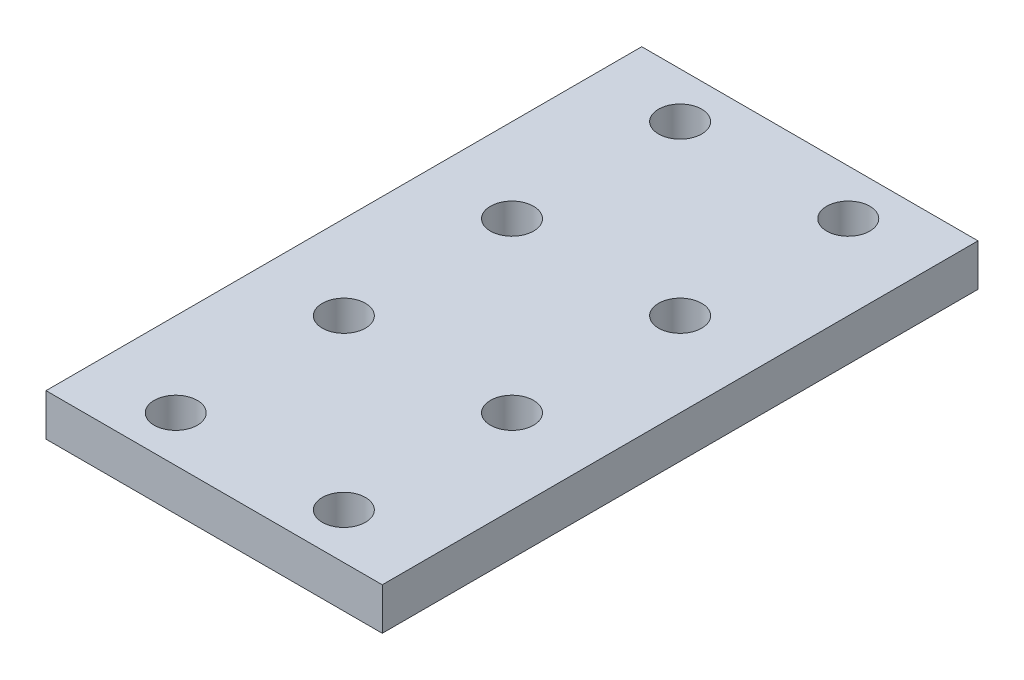
ISO-10303-21;
HEADER;
FILE_DESCRIPTION(('STEP AP214'),'2;1');
FILE_NAME('part.step','',(''),(''),'','','');
FILE_SCHEMA(('AUTOMOTIVE_DESIGN { 1 0 10303 214 1 1 1 1 }'));
ENDSEC;
DATA;
#1=APPLICATION_CONTEXT('core data for automotive mechanical design processes');
#2=APPLICATION_PROTOCOL_DEFINITION('international standard','automotive_design',2000,#1);
#3=PRODUCT_CONTEXT('',#1,'mechanical');
#4=PRODUCT('Part','Part','',(#3));
#5=PRODUCT_RELATED_PRODUCT_CATEGORY('part','',(#4));
#6=PRODUCT_DEFINITION_FORMATION('','',#4);
#7=PRODUCT_DEFINITION_CONTEXT('part definition',#1,'design');
#8=PRODUCT_DEFINITION('design','',#6,#7);
#9=PRODUCT_DEFINITION_SHAPE('','',#8);
#10=(LENGTH_UNIT() NAMED_UNIT(*) SI_UNIT(.MILLI.,.METRE.));
#11=(NAMED_UNIT(*) PLANE_ANGLE_UNIT() SI_UNIT($,.RADIAN.));
#12=(NAMED_UNIT(*) SI_UNIT($,.STERADIAN.) SOLID_ANGLE_UNIT());
#13=UNCERTAINTY_MEASURE_WITH_UNIT(LENGTH_MEASURE(1.E-05),#10,'distance_accuracy_value','');
#14=(GEOMETRIC_REPRESENTATION_CONTEXT(3) GLOBAL_UNCERTAINTY_ASSIGNED_CONTEXT((#13)) GLOBAL_UNIT_ASSIGNED_CONTEXT((#10,
#11,#12)) REPRESENTATION_CONTEXT('',''));
#15=CARTESIAN_POINT('',(0.,0.,0.));
#16=DIRECTION('',(0.,0.,1.));
#17=DIRECTION('',(1.,0.,0.));
#18=AXIS2_PLACEMENT_3D('',#15,#16,#17);
#19=CARTESIAN_POINT('',(62.5,3.175,0.));
#20=DIRECTION('',(1.,0.,0.));
#21=DIRECTION('',(0.,0.,-1.));
#22=AXIS2_PLACEMENT_3D('',#19,#20,#21);
#23=PLANE('',#22);
#24=DIRECTION('',(0.,0.,1.));
#25=VECTOR('',#24,1.);
#26=CARTESIAN_POINT('',(62.5,0.,0.));
#27=LINE('',#26,#25);
#28=CARTESIAN_POINT('',(62.5,0.,-22.5));
#29=VERTEX_POINT('',#28);
#30=CARTESIAN_POINT('',(62.5,0.,22.5));
#31=VERTEX_POINT('',#30);
#32=EDGE_CURVE('E129',#29,#31,#27,.T.);
#33=ORIENTED_EDGE('',*,*,#32,.F.);
#34=DIRECTION('',(0.,-1.,0.));
#35=VECTOR('',#34,1.);
#36=CARTESIAN_POINT('',(62.5,3.175,-22.5));
#37=LINE('',#36,#35);
#38=CARTESIAN_POINT('',(62.5,3.175,-22.5));
#39=VERTEX_POINT('',#38);
#40=EDGE_CURVE('E11',#39,#29,#37,.T.);
#41=ORIENTED_EDGE('',*,*,#40,.F.);
#42=DIRECTION('',(0.,0.,1.));
#43=VECTOR('',#42,1.);
#44=CARTESIAN_POINT('',(62.5,3.175,0.));
#45=LINE('',#44,#43);
#46=CARTESIAN_POINT('',(62.5,3.175,22.5));
#47=VERTEX_POINT('',#46);
#48=EDGE_CURVE('E98',#39,#47,#45,.T.);
#49=ORIENTED_EDGE('',*,*,#48,.T.);
#50=DIRECTION('',(0.,-1.,0.));
#51=VECTOR('',#50,1.);
#52=CARTESIAN_POINT('',(62.5,3.175,22.5));
#53=LINE('',#52,#51);
#54=EDGE_CURVE('E56',#47,#31,#53,.T.);
#55=ORIENTED_EDGE('',*,*,#54,.T.);
#56=EDGE_LOOP('',(#33,#41,#49,#55));
#57=FACE_BOUND('',#56,.T.);
#58=ADVANCED_FACE('F39',(#57),#23,.T.);
#59=CARTESIAN_POINT('',(0.,3.175,-22.5));
#60=DIRECTION('',(0.,0.,-1.));
#61=DIRECTION('',(-1.,0.,0.));
#62=AXIS2_PLACEMENT_3D('',#59,#60,#61);
#63=PLANE('',#62);
#64=DIRECTION('',(1.,0.,0.));
#65=VECTOR('',#64,1.);
#66=CARTESIAN_POINT('',(0.,0.,-22.5));
#67=LINE('',#66,#65);
#68=CARTESIAN_POINT('',(37.1,0.,-22.5));
#69=VERTEX_POINT('',#68);
#70=EDGE_CURVE('E88',#69,#29,#67,.T.);
#71=ORIENTED_EDGE('',*,*,#70,.F.);
#72=DIRECTION('',(0.,-1.,0.));
#73=VECTOR('',#72,1.);
#74=CARTESIAN_POINT('',(37.1,3.175,-22.5));
#75=LINE('',#74,#73);
#76=CARTESIAN_POINT('',(37.1,3.175,-22.5));
#77=VERTEX_POINT('',#76);
#78=EDGE_CURVE('E48',#77,#69,#75,.T.);
#79=ORIENTED_EDGE('',*,*,#78,.F.);
#80=DIRECTION('',(1.,0.,0.));
#81=VECTOR('',#80,1.);
#82=CARTESIAN_POINT('',(0.,3.175,-22.5));
#83=LINE('',#82,#81);
#84=EDGE_CURVE('E86',#77,#39,#83,.T.);
#85=ORIENTED_EDGE('',*,*,#84,.T.);
#86=ORIENTED_EDGE('',*,*,#40,.T.);
#87=EDGE_LOOP('',(#71,#79,#85,#86));
#88=FACE_BOUND('',#87,.T.);
#89=ADVANCED_FACE('F84',(#88),#63,.T.);
#90=CARTESIAN_POINT('',(37.1,3.175,0.));
#91=DIRECTION('',(1.,0.,0.));
#92=DIRECTION('',(0.,0.,-1.));
#93=AXIS2_PLACEMENT_3D('',#90,#91,#92);
#94=PLANE('',#93);
#95=DIRECTION('',(0.,0.,1.));
#96=VECTOR('',#95,1.);
#97=CARTESIAN_POINT('',(37.1,0.,0.));
#98=LINE('',#97,#96);
#99=CARTESIAN_POINT('',(37.1,0.,22.5));
#100=VERTEX_POINT('',#99);
#101=EDGE_CURVE('E132',#69,#100,#98,.T.);
#102=ORIENTED_EDGE('',*,*,#101,.T.);
#103=DIRECTION('',(0.,-1.,0.));
#104=VECTOR('',#103,1.);
#105=CARTESIAN_POINT('',(37.1,3.175,22.5));
#106=LINE('',#105,#104);
#107=CARTESIAN_POINT('',(37.1,3.175,22.5));
#108=VERTEX_POINT('',#107);
#109=EDGE_CURVE('E70',#108,#100,#106,.T.);
#110=ORIENTED_EDGE('',*,*,#109,.F.);
#111=DIRECTION('',(0.,0.,1.));
#112=VECTOR('',#111,1.);
#113=CARTESIAN_POINT('',(37.1,3.175,0.));
#114=LINE('',#113,#112);
#115=EDGE_CURVE('E91',#77,#108,#114,.T.);
#116=ORIENTED_EDGE('',*,*,#115,.F.);
#117=ORIENTED_EDGE('',*,*,#78,.T.);
#118=EDGE_LOOP('',(#102,#110,#116,#117));
#119=FACE_BOUND('',#118,.T.);
#120=ADVANCED_FACE('F92',(#119),#94,.F.);
#121=CARTESIAN_POINT('',(43.45,3.175,-6.35));
#122=DIRECTION('',(0.,-1.,0.));
#123=DIRECTION('',(0.,0.,-1.));
#124=AXIS2_PLACEMENT_3D('',#121,#122,#123);
#125=CYLINDRICAL_SURFACE('',#124,1.62999999999999);
#126=CARTESIAN_POINT('',(43.45,3.175,-6.35));
#127=DIRECTION('',(0.,1.,0.));
#128=DIRECTION('',(0.,0.,1.));
#129=AXIS2_PLACEMENT_3D('',#126,#127,#128);
#130=CIRCLE('',#129,1.62999999999999);
#131=CARTESIAN_POINT('',(43.45,3.175,-4.72));
#132=VERTEX_POINT('',#131);
#133=EDGE_CURVE('E100',#132,#132,#130,.T.);
#134=ORIENTED_EDGE('',*,*,#133,.T.);
#135=EDGE_LOOP('',(#134));
#136=FACE_BOUND('',#135,.T.);
#137=CARTESIAN_POINT('',(43.45,0.,-6.35));
#138=DIRECTION('',(0.,1.,0.));
#139=DIRECTION('',(0.,0.,1.));
#140=AXIS2_PLACEMENT_3D('',#137,#138,#139);
#141=CIRCLE('',#140,1.62999999999999);
#142=CARTESIAN_POINT('',(43.45,0.,-4.72));
#143=VERTEX_POINT('',#142);
#144=EDGE_CURVE('E126',#143,#143,#141,.T.);
#145=ORIENTED_EDGE('',*,*,#144,.F.);
#146=EDGE_LOOP('',(#145));
#147=FACE_BOUND('',#146,.T.);
#148=ADVANCED_FACE('F165',(#136,#147),#125,.F.);
#149=CARTESIAN_POINT('',(56.15,3.175,-6.35));
#150=DIRECTION('',(0.,-1.,0.));
#151=DIRECTION('',(0.,0.,-1.));
#152=AXIS2_PLACEMENT_3D('',#149,#150,#151);
#153=CYLINDRICAL_SURFACE('',#152,1.63000000000001);
#154=CARTESIAN_POINT('',(56.15,3.175,-6.35));
#155=DIRECTION('',(0.,1.,0.));
#156=DIRECTION('',(0.,0.,1.));
#157=AXIS2_PLACEMENT_3D('',#154,#155,#156);
#158=CIRCLE('',#157,1.63000000000001);
#159=CARTESIAN_POINT('',(56.15,3.175,-4.71999999999999));
#160=VERTEX_POINT('',#159);
#161=EDGE_CURVE('E160',#160,#160,#158,.T.);
#162=ORIENTED_EDGE('',*,*,#161,.T.);
#163=EDGE_LOOP('',(#162));
#164=FACE_BOUND('',#163,.T.);
#165=CARTESIAN_POINT('',(56.15,0.,-6.35));
#166=DIRECTION('',(0.,1.,0.));
#167=DIRECTION('',(0.,0.,1.));
#168=AXIS2_PLACEMENT_3D('',#165,#166,#167);
#169=CIRCLE('',#168,1.63000000000001);
#170=CARTESIAN_POINT('',(56.15,0.,-4.71999999999999));
#171=VERTEX_POINT('',#170);
#172=EDGE_CURVE('E123',#171,#171,#169,.T.);
#173=ORIENTED_EDGE('',*,*,#172,.F.);
#174=EDGE_LOOP('',(#173));
#175=FACE_BOUND('',#174,.T.);
#176=ADVANCED_FACE('F191',(#164,#175),#153,.F.);
#177=CARTESIAN_POINT('',(43.45,3.175,-19.05));
#178=DIRECTION('',(0.,-1.,0.));
#179=DIRECTION('',(0.,0.,-1.));
#180=AXIS2_PLACEMENT_3D('',#177,#178,#179);
#181=CYLINDRICAL_SURFACE('',#180,1.63);
#182=CARTESIAN_POINT('',(43.45,3.175,-19.05));
#183=DIRECTION('',(0.,1.,0.));
#184=DIRECTION('',(0.,0.,1.));
#185=AXIS2_PLACEMENT_3D('',#182,#183,#184);
#186=CIRCLE('',#185,1.63);
#187=CARTESIAN_POINT('',(43.45,3.175,-17.42));
#188=VERTEX_POINT('',#187);
#189=EDGE_CURVE('E157',#188,#188,#186,.T.);
#190=ORIENTED_EDGE('',*,*,#189,.T.);
#191=EDGE_LOOP('',(#190));
#192=FACE_BOUND('',#191,.T.);
#193=CARTESIAN_POINT('',(43.45,0.,-19.05));
#194=DIRECTION('',(0.,1.,0.));
#195=DIRECTION('',(0.,0.,1.));
#196=AXIS2_PLACEMENT_3D('',#193,#194,#195);
#197=CIRCLE('',#196,1.63);
#198=CARTESIAN_POINT('',(43.45,0.,-17.42));
#199=VERTEX_POINT('',#198);
#200=EDGE_CURVE('E120',#199,#199,#197,.T.);
#201=ORIENTED_EDGE('',*,*,#200,.F.);
#202=EDGE_LOOP('',(#201));
#203=FACE_BOUND('',#202,.T.);
#204=ADVANCED_FACE('F194',(#192,#203),#181,.F.);
#205=CARTESIAN_POINT('',(56.15,3.175,-19.05));
#206=DIRECTION('',(0.,-1.,0.));
#207=DIRECTION('',(0.,0.,-1.));
#208=AXIS2_PLACEMENT_3D('',#205,#206,#207);
#209=CYLINDRICAL_SURFACE('',#208,1.63000000000001);
#210=CARTESIAN_POINT('',(56.15,3.175,-19.05));
#211=DIRECTION('',(0.,1.,0.));
#212=DIRECTION('',(0.,0.,1.));
#213=AXIS2_PLACEMENT_3D('',#210,#211,#212);
#214=CIRCLE('',#213,1.63000000000001);
#215=CARTESIAN_POINT('',(56.15,3.175,-17.42));
#216=VERTEX_POINT('',#215);
#217=EDGE_CURVE('E154',#216,#216,#214,.T.);
#218=ORIENTED_EDGE('',*,*,#217,.T.);
#219=EDGE_LOOP('',(#218));
#220=FACE_BOUND('',#219,.T.);
#221=CARTESIAN_POINT('',(56.15,0.,-19.05));
#222=DIRECTION('',(0.,1.,0.));
#223=DIRECTION('',(0.,0.,1.));
#224=AXIS2_PLACEMENT_3D('',#221,#222,#223);
#225=CIRCLE('',#224,1.63000000000001);
#226=CARTESIAN_POINT('',(56.15,0.,-17.42));
#227=VERTEX_POINT('',#226);
#228=EDGE_CURVE('E117',#227,#227,#225,.T.);
#229=ORIENTED_EDGE('',*,*,#228,.F.);
#230=EDGE_LOOP('',(#229));
#231=FACE_BOUND('',#230,.T.);
#232=ADVANCED_FACE('F198',(#220,#231),#209,.F.);
#233=CARTESIAN_POINT('',(43.4500000000001,3.175,6.35));
#234=DIRECTION('',(0.,-1.,0.));
#235=DIRECTION('',(0.,0.,-1.));
#236=AXIS2_PLACEMENT_3D('',#233,#234,#235);
#237=CYLINDRICAL_SURFACE('',#236,1.62999999999999);
#238=CARTESIAN_POINT('',(43.4500000000001,3.175,6.35));
#239=DIRECTION('',(0.,1.,0.));
#240=DIRECTION('',(0.,0.,1.));
#241=AXIS2_PLACEMENT_3D('',#238,#239,#240);
#242=CIRCLE('',#241,1.62999999999999);
#243=CARTESIAN_POINT('',(43.4500000000001,3.175,7.98));
#244=VERTEX_POINT('',#243);
#245=EDGE_CURVE('E151',#244,#244,#242,.T.);
#246=ORIENTED_EDGE('',*,*,#245,.T.);
#247=EDGE_LOOP('',(#246));
#248=FACE_BOUND('',#247,.T.);
#249=CARTESIAN_POINT('',(43.4500000000001,0.,6.35));
#250=DIRECTION('',(0.,1.,0.));
#251=DIRECTION('',(0.,0.,1.));
#252=AXIS2_PLACEMENT_3D('',#249,#250,#251);
#253=CIRCLE('',#252,1.62999999999999);
#254=CARTESIAN_POINT('',(43.4500000000001,0.,7.98));
#255=VERTEX_POINT('',#254);
#256=EDGE_CURVE('E114',#255,#255,#253,.T.);
#257=ORIENTED_EDGE('',*,*,#256,.F.);
#258=EDGE_LOOP('',(#257));
#259=FACE_BOUND('',#258,.T.);
#260=ADVANCED_FACE('F202',(#248,#259),#237,.F.);
#261=CARTESIAN_POINT('',(56.1500000000002,3.175,6.35));
#262=DIRECTION('',(0.,-1.,0.));
#263=DIRECTION('',(0.,0.,-1.));
#264=AXIS2_PLACEMENT_3D('',#261,#262,#263);
#265=CYLINDRICAL_SURFACE('',#264,1.63000000000001);
#266=CARTESIAN_POINT('',(56.1500000000002,3.175,6.35));
#267=DIRECTION('',(0.,1.,0.));
#268=DIRECTION('',(0.,0.,1.));
#269=AXIS2_PLACEMENT_3D('',#266,#267,#268);
#270=CIRCLE('',#269,1.63000000000001);
#271=CARTESIAN_POINT('',(56.1500000000002,3.175,7.98000000000001));
#272=VERTEX_POINT('',#271);
#273=EDGE_CURVE('E146',#272,#272,#270,.T.);
#274=ORIENTED_EDGE('',*,*,#273,.T.);
#275=EDGE_LOOP('',(#274));
#276=FACE_BOUND('',#275,.T.);
#277=CARTESIAN_POINT('',(56.1500000000002,0.,6.35));
#278=DIRECTION('',(0.,1.,0.));
#279=DIRECTION('',(0.,0.,1.));
#280=AXIS2_PLACEMENT_3D('',#277,#278,#279);
#281=CIRCLE('',#280,1.63000000000001);
#282=CARTESIAN_POINT('',(56.1500000000002,0.,7.98000000000001));
#283=VERTEX_POINT('',#282);
#284=EDGE_CURVE('E111',#283,#283,#281,.T.);
#285=ORIENTED_EDGE('',*,*,#284,.F.);
#286=EDGE_LOOP('',(#285));
#287=FACE_BOUND('',#286,.T.);
#288=ADVANCED_FACE('F206',(#276,#287),#265,.F.);
#289=CARTESIAN_POINT('',(43.4500000000001,3.175,19.05));
#290=DIRECTION('',(0.,-1.,0.));
#291=DIRECTION('',(0.,0.,-1.));
#292=AXIS2_PLACEMENT_3D('',#289,#290,#291);
#293=CYLINDRICAL_SURFACE('',#292,1.63);
#294=CARTESIAN_POINT('',(43.4500000000001,3.175,19.05));
#295=DIRECTION('',(0.,1.,0.));
#296=DIRECTION('',(0.,0.,1.));
#297=AXIS2_PLACEMENT_3D('',#294,#295,#296);
#298=CIRCLE('',#297,1.63);
#299=CARTESIAN_POINT('',(43.4500000000001,3.175,20.68));
#300=VERTEX_POINT('',#299);
#301=EDGE_CURVE('E141',#300,#300,#298,.T.);
#302=ORIENTED_EDGE('',*,*,#301,.T.);
#303=EDGE_LOOP('',(#302));
#304=FACE_BOUND('',#303,.T.);
#305=CARTESIAN_POINT('',(43.4500000000001,0.,19.05));
#306=DIRECTION('',(0.,1.,0.));
#307=DIRECTION('',(0.,0.,1.));
#308=AXIS2_PLACEMENT_3D('',#305,#306,#307);
#309=CIRCLE('',#308,1.63);
#310=CARTESIAN_POINT('',(43.4500000000001,0.,20.68));
#311=VERTEX_POINT('',#310);
#312=EDGE_CURVE('E108',#311,#311,#309,.T.);
#313=ORIENTED_EDGE('',*,*,#312,.F.);
#314=EDGE_LOOP('',(#313));
#315=FACE_BOUND('',#314,.T.);
#316=ADVANCED_FACE('F209',(#304,#315),#293,.F.);
#317=CARTESIAN_POINT('',(56.15,3.175,19.05));
#318=DIRECTION('',(0.,-1.,0.));
#319=DIRECTION('',(0.,0.,-1.));
#320=AXIS2_PLACEMENT_3D('',#317,#318,#319);
#321=CYLINDRICAL_SURFACE('',#320,1.63);
#322=CARTESIAN_POINT('',(56.15,3.175,19.05));
#323=DIRECTION('',(0.,1.,0.));
#324=DIRECTION('',(0.,0.,1.));
#325=AXIS2_PLACEMENT_3D('',#322,#323,#324);
#326=CIRCLE('',#325,1.63);
#327=CARTESIAN_POINT('',(56.15,3.175,20.68));
#328=VERTEX_POINT('',#327);
#329=EDGE_CURVE('E137',#328,#328,#326,.T.);
#330=ORIENTED_EDGE('',*,*,#329,.T.);
#331=EDGE_LOOP('',(#330));
#332=FACE_BOUND('',#331,.T.);
#333=CARTESIAN_POINT('',(56.15,0.,19.05));
#334=DIRECTION('',(0.,1.,0.));
#335=DIRECTION('',(0.,0.,1.));
#336=AXIS2_PLACEMENT_3D('',#333,#334,#335);
#337=CIRCLE('',#336,1.63);
#338=CARTESIAN_POINT('',(56.15,0.,20.68));
#339=VERTEX_POINT('',#338);
#340=EDGE_CURVE('E105',#339,#339,#337,.T.);
#341=ORIENTED_EDGE('',*,*,#340,.F.);
#342=EDGE_LOOP('',(#341));
#343=FACE_BOUND('',#342,.T.);
#344=ADVANCED_FACE('F41',(#332,#343),#321,.F.);
#345=CARTESIAN_POINT('',(0.,3.175,22.5));
#346=DIRECTION('',(0.,0.,1.));
#347=DIRECTION('',(1.,0.,0.));
#348=AXIS2_PLACEMENT_3D('',#345,#346,#347);
#349=PLANE('',#348);
#350=DIRECTION('',(-1.,0.,0.));
#351=VECTOR('',#350,1.);
#352=CARTESIAN_POINT('',(0.,0.,22.5));
#353=LINE('',#352,#351);
#354=EDGE_CURVE('E134',#31,#100,#353,.T.);
#355=ORIENTED_EDGE('',*,*,#354,.F.);
#356=ORIENTED_EDGE('',*,*,#54,.F.);
#357=DIRECTION('',(-1.,0.,0.));
#358=VECTOR('',#357,1.);
#359=CARTESIAN_POINT('',(0.,3.175,22.5));
#360=LINE('',#359,#358);
#361=EDGE_CURVE('E95',#47,#108,#360,.T.);
#362=ORIENTED_EDGE('',*,*,#361,.T.);
#363=ORIENTED_EDGE('',*,*,#109,.T.);
#364=EDGE_LOOP('',(#355,#356,#362,#363));
#365=FACE_BOUND('',#364,.T.);
#366=ADVANCED_FACE('F170',(#365),#349,.T.);
#367=CARTESIAN_POINT('',(0.,3.175,0.));
#368=DIRECTION('',(0.,1.,0.));
#369=DIRECTION('',(0.,0.,1.));
#370=AXIS2_PLACEMENT_3D('',#367,#368,#369);
#371=PLANE('',#370);
#372=ORIENTED_EDGE('',*,*,#329,.F.);
#373=EDGE_LOOP('',(#372));
#374=FACE_BOUND('',#373,.T.);
#375=ORIENTED_EDGE('',*,*,#301,.F.);
#376=EDGE_LOOP('',(#375));
#377=FACE_BOUND('',#376,.T.);
#378=ORIENTED_EDGE('',*,*,#273,.F.);
#379=EDGE_LOOP('',(#378));
#380=FACE_BOUND('',#379,.T.);
#381=ORIENTED_EDGE('',*,*,#245,.F.);
#382=EDGE_LOOP('',(#381));
#383=FACE_BOUND('',#382,.T.);
#384=ORIENTED_EDGE('',*,*,#217,.F.);
#385=EDGE_LOOP('',(#384));
#386=FACE_BOUND('',#385,.T.);
#387=ORIENTED_EDGE('',*,*,#189,.F.);
#388=EDGE_LOOP('',(#387));
#389=FACE_BOUND('',#388,.T.);
#390=ORIENTED_EDGE('',*,*,#161,.F.);
#391=EDGE_LOOP('',(#390));
#392=FACE_BOUND('',#391,.T.);
#393=ORIENTED_EDGE('',*,*,#133,.F.);
#394=EDGE_LOOP('',(#393));
#395=FACE_BOUND('',#394,.T.);
#396=ORIENTED_EDGE('',*,*,#48,.F.);
#397=ORIENTED_EDGE('',*,*,#84,.F.);
#398=ORIENTED_EDGE('',*,*,#115,.T.);
#399=ORIENTED_EDGE('',*,*,#361,.F.);
#400=EDGE_LOOP('',(#396,#397,#398,#399));
#401=FACE_BOUND('',#400,.T.);
#402=ADVANCED_FACE('F97',(#374,#377,#380,#383,#386,#389,#392,#395,#401),#371,.T.);
#403=CARTESIAN_POINT('',(0.,0.,0.));
#404=DIRECTION('',(0.,1.,0.));
#405=DIRECTION('',(0.,0.,1.));
#406=AXIS2_PLACEMENT_3D('',#403,#404,#405);
#407=PLANE('',#406);
#408=ORIENTED_EDGE('',*,*,#340,.T.);
#409=EDGE_LOOP('',(#408));
#410=FACE_BOUND('',#409,.T.);
#411=ORIENTED_EDGE('',*,*,#312,.T.);
#412=EDGE_LOOP('',(#411));
#413=FACE_BOUND('',#412,.T.);
#414=ORIENTED_EDGE('',*,*,#284,.T.);
#415=EDGE_LOOP('',(#414));
#416=FACE_BOUND('',#415,.T.);
#417=ORIENTED_EDGE('',*,*,#256,.T.);
#418=EDGE_LOOP('',(#417));
#419=FACE_BOUND('',#418,.T.);
#420=ORIENTED_EDGE('',*,*,#228,.T.);
#421=EDGE_LOOP('',(#420));
#422=FACE_BOUND('',#421,.T.);
#423=ORIENTED_EDGE('',*,*,#200,.T.);
#424=EDGE_LOOP('',(#423));
#425=FACE_BOUND('',#424,.T.);
#426=ORIENTED_EDGE('',*,*,#172,.T.);
#427=EDGE_LOOP('',(#426));
#428=FACE_BOUND('',#427,.T.);
#429=ORIENTED_EDGE('',*,*,#144,.T.);
#430=EDGE_LOOP('',(#429));
#431=FACE_BOUND('',#430,.T.);
#432=ORIENTED_EDGE('',*,*,#32,.T.);
#433=ORIENTED_EDGE('',*,*,#354,.T.);
#434=ORIENTED_EDGE('',*,*,#101,.F.);
#435=ORIENTED_EDGE('',*,*,#70,.T.);
#436=EDGE_LOOP('',(#432,#433,#434,#435));
#437=FACE_BOUND('',#436,.T.);
#438=ADVANCED_FACE('F169',(#410,#413,#416,#419,#422,#425,#428,#431,#437),#407,.F.);
#439=CLOSED_SHELL('',(#58,#89,#120,#148,#176,#204,#232,#260,#288,#316,#344,#366,#402,#438));
#440=MANIFOLD_SOLID_BREP('B2',#439);
#441=ADVANCED_BREP_SHAPE_REPRESENTATION('',(#18,#440),#14);
#442=SHAPE_DEFINITION_REPRESENTATION(#9,#441);
ENDSEC;
END-ISO-10303-21;
